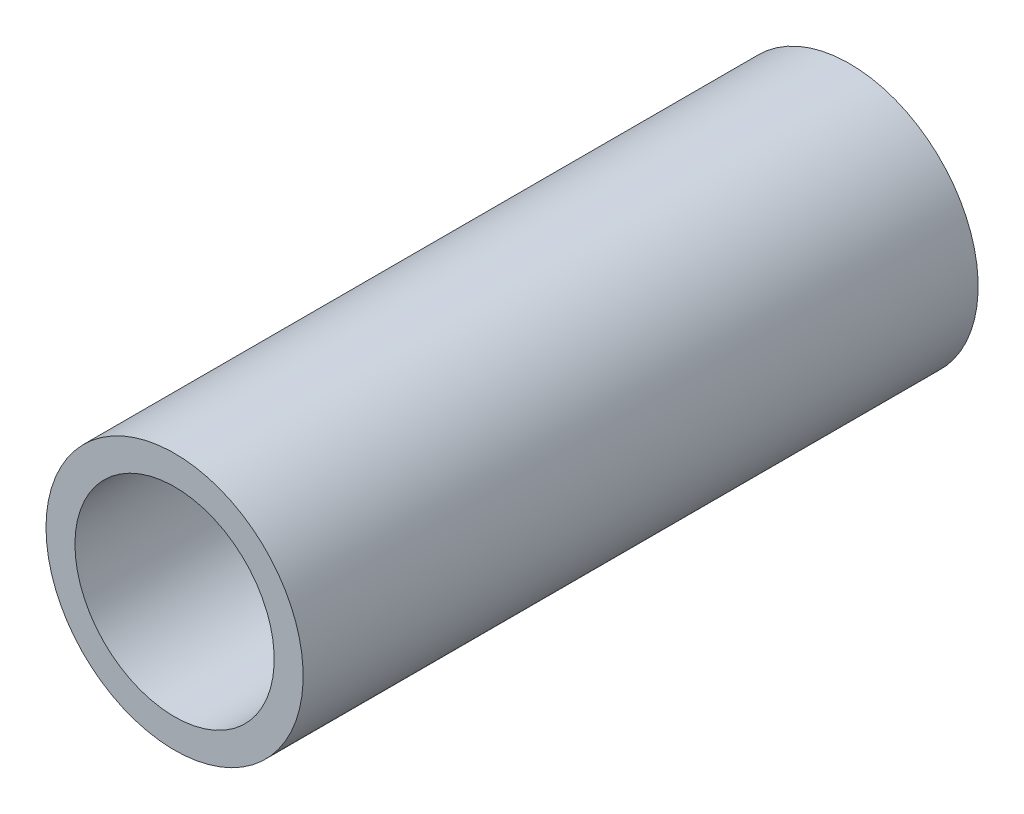
ISO-10303-21;
HEADER;
FILE_DESCRIPTION(('STEP AP214'),'2;1');
FILE_NAME('part.step','',(''),(''),'','','');
FILE_SCHEMA(('AUTOMOTIVE_DESIGN { 1 0 10303 214 1 1 1 1 }'));
ENDSEC;
DATA;
#1=APPLICATION_CONTEXT('core data for automotive mechanical design processes');
#2=APPLICATION_PROTOCOL_DEFINITION('international standard','automotive_design',2000,#1);
#3=PRODUCT_CONTEXT('',#1,'mechanical');
#4=PRODUCT('Part','Part','',(#3));
#5=PRODUCT_RELATED_PRODUCT_CATEGORY('part','',(#4));
#6=PRODUCT_DEFINITION_FORMATION('','',#4);
#7=PRODUCT_DEFINITION_CONTEXT('part definition',#1,'design');
#8=PRODUCT_DEFINITION('design','',#6,#7);
#9=PRODUCT_DEFINITION_SHAPE('','',#8);
#10=(LENGTH_UNIT() NAMED_UNIT(*) SI_UNIT(.MILLI.,.METRE.));
#11=(NAMED_UNIT(*) PLANE_ANGLE_UNIT() SI_UNIT($,.RADIAN.));
#12=(NAMED_UNIT(*) SI_UNIT($,.STERADIAN.) SOLID_ANGLE_UNIT());
#13=UNCERTAINTY_MEASURE_WITH_UNIT(LENGTH_MEASURE(1.E-05),#10,'distance_accuracy_value','');
#14=(GEOMETRIC_REPRESENTATION_CONTEXT(3) GLOBAL_UNCERTAINTY_ASSIGNED_CONTEXT((#13)) GLOBAL_UNIT_ASSIGNED_CONTEXT((#10,
#11,#12)) REPRESENTATION_CONTEXT('',''));
#15=CARTESIAN_POINT('',(0.,0.,0.));
#16=DIRECTION('',(0.,0.,1.));
#17=DIRECTION('',(1.,0.,0.));
#18=AXIS2_PLACEMENT_3D('',#15,#16,#17);
#19=CARTESIAN_POINT('',(0.,0.,21.));
#20=DIRECTION('',(0.,0.,1.));
#21=DIRECTION('',(1.,0.,0.));
#22=AXIS2_PLACEMENT_3D('',#19,#20,#21);
#23=PLANE('',#22);
#24=CARTESIAN_POINT('',(0.,0.,21.));
#25=DIRECTION('',(0.,0.,1.));
#26=DIRECTION('',(1.,0.,0.));
#27=AXIS2_PLACEMENT_3D('',#24,#25,#26);
#28=CIRCLE('',#27,4.);
#29=CARTESIAN_POINT('',(-4.,0.,21.));
#30=VERTEX_POINT('',#29);
#31=EDGE_CURVE('E10',#30,#30,#28,.T.);
#32=ORIENTED_EDGE('',*,*,#31,.T.);
#33=EDGE_LOOP('',(#32));
#34=FACE_BOUND('',#33,.T.);
#35=CARTESIAN_POINT('',(0.,0.,21.));
#36=DIRECTION('',(0.,0.,1.));
#37=DIRECTION('',(1.,0.,0.));
#38=AXIS2_PLACEMENT_3D('',#35,#36,#37);
#39=CIRCLE('',#38,3.1);
#40=CARTESIAN_POINT('',(-3.1,0.,21.));
#41=VERTEX_POINT('',#40);
#42=EDGE_CURVE('E44',#41,#41,#39,.T.);
#43=ORIENTED_EDGE('',*,*,#42,.F.);
#44=EDGE_LOOP('',(#43));
#45=FACE_BOUND('',#44,.T.);
#46=ADVANCED_FACE('F33',(#34,#45),#23,.T.);
#47=CARTESIAN_POINT('',(0.,0.,0.));
#48=DIRECTION('',(0.,0.,1.));
#49=DIRECTION('',(1.,0.,0.));
#50=AXIS2_PLACEMENT_3D('',#47,#48,#49);
#51=PLANE('',#50);
#52=CARTESIAN_POINT('',(0.,0.,0.));
#53=DIRECTION('',(0.,0.,1.));
#54=DIRECTION('',(1.,0.,0.));
#55=AXIS2_PLACEMENT_3D('',#52,#53,#54);
#56=CIRCLE('',#55,4.);
#57=CARTESIAN_POINT('',(-4.,0.,0.));
#58=VERTEX_POINT('',#57);
#59=EDGE_CURVE('E37',#58,#58,#56,.T.);
#60=ORIENTED_EDGE('',*,*,#59,.F.);
#61=EDGE_LOOP('',(#60));
#62=FACE_BOUND('',#61,.T.);
#63=CARTESIAN_POINT('',(0.,0.,0.));
#64=DIRECTION('',(0.,0.,1.));
#65=DIRECTION('',(1.,0.,0.));
#66=AXIS2_PLACEMENT_3D('',#63,#64,#65);
#67=CIRCLE('',#66,3.1);
#68=CARTESIAN_POINT('',(-3.1,0.,0.));
#69=VERTEX_POINT('',#68);
#70=EDGE_CURVE('E46',#69,#69,#67,.T.);
#71=ORIENTED_EDGE('',*,*,#70,.T.);
#72=EDGE_LOOP('',(#71));
#73=FACE_BOUND('',#72,.T.);
#74=ADVANCED_FACE('F56',(#62,#73),#51,.F.);
#75=CARTESIAN_POINT('',(0.,0.,21.));
#76=DIRECTION('',(0.,0.,-1.));
#77=DIRECTION('',(-1.,0.,0.));
#78=AXIS2_PLACEMENT_3D('',#75,#76,#77);
#79=CYLINDRICAL_SURFACE('',#78,4.);
#80=CARTESIAN_POINT('',(-4.,0.,21.));
#81=CARTESIAN_POINT('',(-4.,0.,20.78125));
#82=CARTESIAN_POINT('',(-4.,0.,20.5625));
#83=CARTESIAN_POINT('',(-4.,0.,20.125));
#84=CARTESIAN_POINT('',(-4.,0.,19.90625));
#85=CARTESIAN_POINT('',(-4.,0.,19.46875));
#86=CARTESIAN_POINT('',(-4.,0.,19.25));
#87=CARTESIAN_POINT('',(-4.,0.,18.8125));
#88=CARTESIAN_POINT('',(-4.,0.,18.59375));
#89=CARTESIAN_POINT('',(-4.,0.,18.15625));
#90=CARTESIAN_POINT('',(-4.,0.,17.9375));
#91=CARTESIAN_POINT('',(-4.,0.,17.5));
#92=CARTESIAN_POINT('',(-4.,0.,17.28125));
#93=CARTESIAN_POINT('',(-4.,0.,16.84375));
#94=CARTESIAN_POINT('',(-4.,0.,16.625));
#95=CARTESIAN_POINT('',(-4.,0.,16.1875));
#96=CARTESIAN_POINT('',(-4.,0.,15.96875));
#97=CARTESIAN_POINT('',(-4.,0.,15.53125));
#98=CARTESIAN_POINT('',(-4.,0.,15.3125));
#99=CARTESIAN_POINT('',(-4.,0.,14.875));
#100=CARTESIAN_POINT('',(-4.,0.,14.65625));
#101=CARTESIAN_POINT('',(-4.,0.,14.21875));
#102=CARTESIAN_POINT('',(-4.,0.,14.));
#103=CARTESIAN_POINT('',(-4.,0.,13.5625));
#104=CARTESIAN_POINT('',(-4.,0.,13.34375));
#105=CARTESIAN_POINT('',(-4.,0.,12.90625));
#106=CARTESIAN_POINT('',(-4.,0.,12.6875));
#107=CARTESIAN_POINT('',(-4.,0.,12.25));
#108=CARTESIAN_POINT('',(-4.,0.,12.03125));
#109=CARTESIAN_POINT('',(-4.,0.,11.59375));
#110=CARTESIAN_POINT('',(-4.,0.,11.375));
#111=CARTESIAN_POINT('',(-4.,0.,10.9375));
#112=CARTESIAN_POINT('',(-4.,0.,10.71875));
#113=CARTESIAN_POINT('',(-4.,0.,10.28125));
#114=CARTESIAN_POINT('',(-4.,0.,10.0625));
#115=CARTESIAN_POINT('',(-4.,0.,9.625));
#116=CARTESIAN_POINT('',(-4.,0.,9.40625));
#117=CARTESIAN_POINT('',(-4.,0.,8.96875));
#118=CARTESIAN_POINT('',(-4.,0.,8.75));
#119=CARTESIAN_POINT('',(-4.,0.,8.3125));
#120=CARTESIAN_POINT('',(-4.,0.,8.09375));
#121=CARTESIAN_POINT('',(-4.,0.,7.65625));
#122=CARTESIAN_POINT('',(-4.,0.,7.4375));
#123=CARTESIAN_POINT('',(-4.,0.,7.));
#124=CARTESIAN_POINT('',(-4.,0.,6.78125));
#125=CARTESIAN_POINT('',(-4.,0.,6.34375));
#126=CARTESIAN_POINT('',(-4.,0.,6.125));
#127=CARTESIAN_POINT('',(-4.,0.,5.6875));
#128=CARTESIAN_POINT('',(-4.,0.,5.46875));
#129=CARTESIAN_POINT('',(-4.,0.,5.03125));
#130=CARTESIAN_POINT('',(-4.,0.,4.8125));
#131=CARTESIAN_POINT('',(-4.,0.,4.375));
#132=CARTESIAN_POINT('',(-4.,0.,4.15625));
#133=CARTESIAN_POINT('',(-4.,0.,3.71875));
#134=CARTESIAN_POINT('',(-4.,0.,3.5));
#135=CARTESIAN_POINT('',(-4.,0.,3.0625));
#136=CARTESIAN_POINT('',(-4.,0.,2.84375));
#137=CARTESIAN_POINT('',(-4.,0.,2.40625));
#138=CARTESIAN_POINT('',(-4.,0.,2.1875));
#139=CARTESIAN_POINT('',(-4.,0.,1.75));
#140=CARTESIAN_POINT('',(-4.,0.,1.53125));
#141=CARTESIAN_POINT('',(-4.,0.,1.09375));
#142=CARTESIAN_POINT('',(-4.,0.,0.875000000000001));
#143=CARTESIAN_POINT('',(-4.,0.,0.4375));
#144=CARTESIAN_POINT('',(-4.,0.,0.21875));
#145=CARTESIAN_POINT('',(-4.,0.,0.));
#146=B_SPLINE_CURVE_WITH_KNOTS('',3,(#80,#81,#82,#83,#84,#85,#86,#87,#88,#89,#90,#91,#92,#93,
#94,#95,#96,#97,#98,#99,#100,#101,#102,#103,#104,#105,#106,#107,#108,#109,#110,#111,#112,#113,
#114,#115,#116,#117,#118,#119,#120,#121,#122,#123,#124,#125,#126,#127,#128,#129,#130,#131,#132,
#133,#134,#135,#136,#137,#138,#139,#140,#141,#142,#143,#144,#145),.UNSPECIFIED.,.F.,.F.,(4,2,2,
2,2,2,2,2,2,2,2,2,2,2,2,2,2,2,2,2,2,2,2,2,2,2,2,2,2,2,2,2,4),(0.,0.656249999999997,1.3125,
1.96875,2.625,3.28125,3.9375,4.59375,5.25,5.90625,6.5625,7.21875,7.875,8.53125,9.1875,9.84375,
10.5,11.15625,11.8125,12.46875,13.125,13.78125,14.4375,15.09375,15.75,16.40625,17.0625,17.71875,
18.375,19.03125,19.6875,20.34375,21.),.UNSPECIFIED.);
#147=EDGE_CURVE('BSEAM35',#30,#58,#146,.T.);
#148=ORIENTED_EDGE('',*,*,#31,.F.);
#149=ORIENTED_EDGE('',*,*,#59,.T.);
#150=ORIENTED_EDGE('',*,*,#147,.T.);
#151=ORIENTED_EDGE('',*,*,#147,.F.);
#152=EDGE_LOOP('',(#148,#150,#149,#151));
#153=FACE_BOUND('',#152,.T.);
#154=ADVANCED_FACE('F35',(#153),#79,.T.);
#155=CARTESIAN_POINT('',(0.,0.,21.));
#156=DIRECTION('',(0.,0.,-1.));
#157=DIRECTION('',(-1.,0.,0.));
#158=AXIS2_PLACEMENT_3D('',#155,#156,#157);
#159=CYLINDRICAL_SURFACE('',#158,3.1);
#160=CARTESIAN_POINT('',(-3.1,0.,21.));
#161=CARTESIAN_POINT('',(-3.1,0.,20.78125));
#162=CARTESIAN_POINT('',(-3.1,0.,20.5625));
#163=CARTESIAN_POINT('',(-3.1,0.,20.125));
#164=CARTESIAN_POINT('',(-3.1,0.,19.90625));
#165=CARTESIAN_POINT('',(-3.1,0.,19.46875));
#166=CARTESIAN_POINT('',(-3.1,0.,19.25));
#167=CARTESIAN_POINT('',(-3.1,0.,18.8125));
#168=CARTESIAN_POINT('',(-3.1,0.,18.59375));
#169=CARTESIAN_POINT('',(-3.1,0.,18.15625));
#170=CARTESIAN_POINT('',(-3.1,0.,17.9375));
#171=CARTESIAN_POINT('',(-3.1,0.,17.5));
#172=CARTESIAN_POINT('',(-3.1,0.,17.28125));
#173=CARTESIAN_POINT('',(-3.1,0.,16.84375));
#174=CARTESIAN_POINT('',(-3.1,0.,16.625));
#175=CARTESIAN_POINT('',(-3.1,0.,16.1875));
#176=CARTESIAN_POINT('',(-3.1,0.,15.96875));
#177=CARTESIAN_POINT('',(-3.1,0.,15.53125));
#178=CARTESIAN_POINT('',(-3.1,0.,15.3125));
#179=CARTESIAN_POINT('',(-3.1,0.,14.875));
#180=CARTESIAN_POINT('',(-3.1,0.,14.65625));
#181=CARTESIAN_POINT('',(-3.1,0.,14.21875));
#182=CARTESIAN_POINT('',(-3.1,0.,14.));
#183=CARTESIAN_POINT('',(-3.1,0.,13.5625));
#184=CARTESIAN_POINT('',(-3.1,0.,13.34375));
#185=CARTESIAN_POINT('',(-3.1,0.,12.90625));
#186=CARTESIAN_POINT('',(-3.1,0.,12.6875));
#187=CARTESIAN_POINT('',(-3.1,0.,12.25));
#188=CARTESIAN_POINT('',(-3.1,0.,12.03125));
#189=CARTESIAN_POINT('',(-3.1,0.,11.59375));
#190=CARTESIAN_POINT('',(-3.1,0.,11.375));
#191=CARTESIAN_POINT('',(-3.1,0.,10.9375));
#192=CARTESIAN_POINT('',(-3.1,0.,10.71875));
#193=CARTESIAN_POINT('',(-3.1,0.,10.28125));
#194=CARTESIAN_POINT('',(-3.1,0.,10.0625));
#195=CARTESIAN_POINT('',(-3.1,0.,9.625));
#196=CARTESIAN_POINT('',(-3.1,0.,9.40625));
#197=CARTESIAN_POINT('',(-3.1,0.,8.96875));
#198=CARTESIAN_POINT('',(-3.1,0.,8.75));
#199=CARTESIAN_POINT('',(-3.1,0.,8.3125));
#200=CARTESIAN_POINT('',(-3.1,0.,8.09375));
#201=CARTESIAN_POINT('',(-3.1,0.,7.65625));
#202=CARTESIAN_POINT('',(-3.1,0.,7.4375));
#203=CARTESIAN_POINT('',(-3.1,0.,7.));
#204=CARTESIAN_POINT('',(-3.1,0.,6.78125));
#205=CARTESIAN_POINT('',(-3.1,0.,6.34375));
#206=CARTESIAN_POINT('',(-3.1,0.,6.125));
#207=CARTESIAN_POINT('',(-3.1,0.,5.6875));
#208=CARTESIAN_POINT('',(-3.1,0.,5.46875));
#209=CARTESIAN_POINT('',(-3.1,0.,5.03125));
#210=CARTESIAN_POINT('',(-3.1,0.,4.8125));
#211=CARTESIAN_POINT('',(-3.1,0.,4.375));
#212=CARTESIAN_POINT('',(-3.1,0.,4.15625));
#213=CARTESIAN_POINT('',(-3.1,0.,3.71875));
#214=CARTESIAN_POINT('',(-3.1,0.,3.5));
#215=CARTESIAN_POINT('',(-3.1,0.,3.0625));
#216=CARTESIAN_POINT('',(-3.1,0.,2.84375));
#217=CARTESIAN_POINT('',(-3.1,0.,2.40625));
#218=CARTESIAN_POINT('',(-3.1,0.,2.1875));
#219=CARTESIAN_POINT('',(-3.1,0.,1.75));
#220=CARTESIAN_POINT('',(-3.1,0.,1.53125));
#221=CARTESIAN_POINT('',(-3.1,0.,1.09375));
#222=CARTESIAN_POINT('',(-3.1,0.,0.875000000000001));
#223=CARTESIAN_POINT('',(-3.1,0.,0.4375));
#224=CARTESIAN_POINT('',(-3.1,0.,0.21875));
#225=CARTESIAN_POINT('',(-3.1,0.,0.));
#226=B_SPLINE_CURVE_WITH_KNOTS('',3,(#160,#161,#162,#163,#164,#165,#166,#167,#168,#169,#170,
#171,#172,#173,#174,#175,#176,#177,#178,#179,#180,#181,#182,#183,#184,#185,#186,#187,#188,#189,
#190,#191,#192,#193,#194,#195,#196,#197,#198,#199,#200,#201,#202,#203,#204,#205,#206,#207,#208,
#209,#210,#211,#212,#213,#214,#215,#216,#217,#218,#219,#220,#221,#222,#223,#224,#225),
.UNSPECIFIED.,.F.,.F.,(4,2,2,2,2,2,2,2,2,2,2,2,2,2,2,2,2,2,2,2,2,2,2,2,2,2,2,2,2,2,2,2,4),(0.,
0.656250000000001,1.3125,1.96875,2.625,3.28125,3.9375,4.59375,5.25,5.90625,6.5625,7.21875,7.875,
8.53125,9.1875,9.84375,10.5,11.15625,11.8125,12.46875,13.125,13.78125,14.4375,15.09375,15.75,
16.40625,17.0625,17.71875,18.375,19.03125,19.6875,20.34375,21.),.UNSPECIFIED.);
#227=EDGE_CURVE('BSEAM52',#41,#69,#226,.T.);
#228=ORIENTED_EDGE('',*,*,#42,.T.);
#229=ORIENTED_EDGE('',*,*,#70,.F.);
#230=ORIENTED_EDGE('',*,*,#227,.T.);
#231=ORIENTED_EDGE('',*,*,#227,.F.);
#232=EDGE_LOOP('',(#228,#230,#229,#231));
#233=FACE_BOUND('',#232,.T.);
#234=ADVANCED_FACE('F52',(#233),#159,.F.);
#235=CLOSED_SHELL('',(#46,#74,#154,#234));
#236=MANIFOLD_SOLID_BREP('B2',#235);
#237=ADVANCED_BREP_SHAPE_REPRESENTATION('',(#18,#236),#14);
#238=SHAPE_DEFINITION_REPRESENTATION(#9,#237);
ENDSEC;
END-ISO-10303-21;
